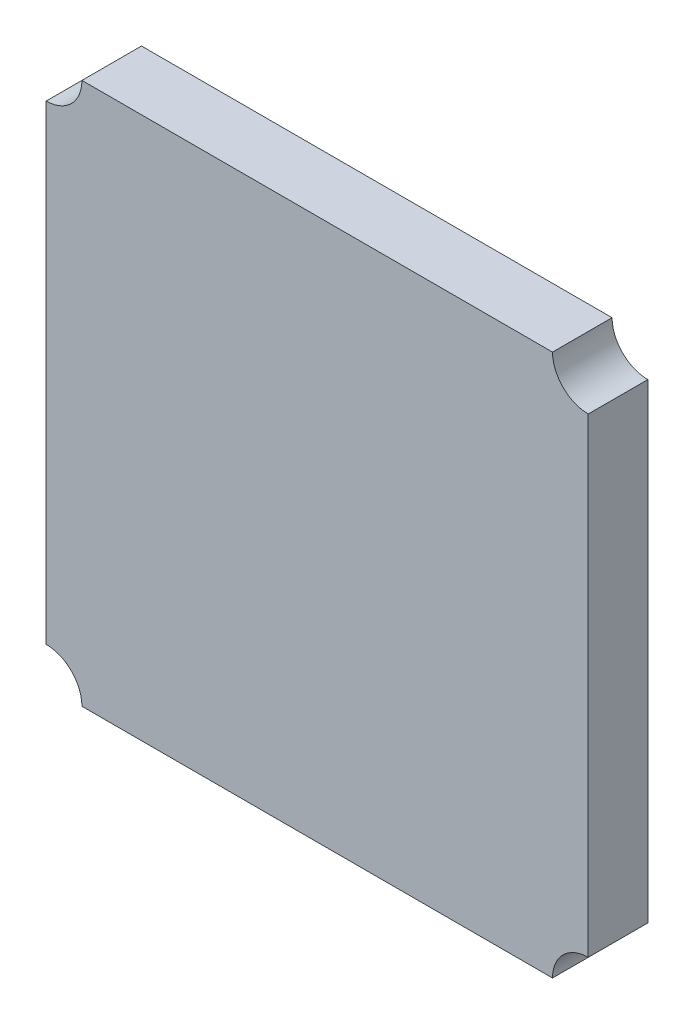
ISO-10303-21;
HEADER;
FILE_DESCRIPTION(('STEP AP214'),'2;1');
FILE_NAME('part.step','',(''),(''),'','','');
FILE_SCHEMA(('AUTOMOTIVE_DESIGN { 1 0 10303 214 1 1 1 1 }'));
ENDSEC;
DATA;
#1=APPLICATION_CONTEXT('core data for automotive mechanical design processes');
#2=APPLICATION_PROTOCOL_DEFINITION('international standard','automotive_design',2000,#1);
#3=PRODUCT_CONTEXT('',#1,'mechanical');
#4=PRODUCT('Part','Part','',(#3));
#5=PRODUCT_RELATED_PRODUCT_CATEGORY('part','',(#4));
#6=PRODUCT_DEFINITION_FORMATION('','',#4);
#7=PRODUCT_DEFINITION_CONTEXT('part definition',#1,'design');
#8=PRODUCT_DEFINITION('design','',#6,#7);
#9=PRODUCT_DEFINITION_SHAPE('','',#8);
#10=(LENGTH_UNIT() NAMED_UNIT(*) SI_UNIT(.MILLI.,.METRE.));
#11=(NAMED_UNIT(*) PLANE_ANGLE_UNIT() SI_UNIT($,.RADIAN.));
#12=(NAMED_UNIT(*) SI_UNIT($,.STERADIAN.) SOLID_ANGLE_UNIT());
#13=UNCERTAINTY_MEASURE_WITH_UNIT(LENGTH_MEASURE(1.E-05),#10,'distance_accuracy_value','');
#14=(GEOMETRIC_REPRESENTATION_CONTEXT(3) GLOBAL_UNCERTAINTY_ASSIGNED_CONTEXT((#13)) GLOBAL_UNIT_ASSIGNED_CONTEXT((#10,
#11,#12)) REPRESENTATION_CONTEXT('',''));
#15=CARTESIAN_POINT('',(0.,0.,0.));
#16=DIRECTION('',(0.,0.,1.));
#17=DIRECTION('',(1.,0.,0.));
#18=AXIS2_PLACEMENT_3D('',#15,#16,#17);
#19=CARTESIAN_POINT('',(0.,0.,5.));
#20=DIRECTION('',(0.,0.,-1.));
#21=DIRECTION('',(-1.,0.,0.));
#22=AXIS2_PLACEMENT_3D('',#19,#20,#21);
#23=CYLINDRICAL_SURFACE('',#22,3.);
#24=CARTESIAN_POINT('',(0.,0.,0.));
#25=DIRECTION('',(0.,0.,1.));
#26=DIRECTION('',(1.,0.,0.));
#27=AXIS2_PLACEMENT_3D('',#24,#25,#26);
#28=CIRCLE('',#27,3.);
#29=CARTESIAN_POINT('',(0.,-3.,0.));
#30=VERTEX_POINT('',#29);
#31=CARTESIAN_POINT('',(3.,0.,0.));
#32=VERTEX_POINT('',#31);
#33=EDGE_CURVE('E129',#30,#32,#28,.T.);
#34=ORIENTED_EDGE('',*,*,#33,.F.);
#35=DIRECTION('',(0.,0.,-1.));
#36=VECTOR('',#35,1.);
#37=CARTESIAN_POINT('',(0.,-3.,5.));
#38=LINE('',#37,#36);
#39=CARTESIAN_POINT('',(0.,-3.,5.));
#40=VERTEX_POINT('',#39);
#41=EDGE_CURVE('E11',#40,#30,#38,.T.);
#42=ORIENTED_EDGE('',*,*,#41,.F.);
#43=CARTESIAN_POINT('',(0.,0.,5.));
#44=DIRECTION('',(0.,0.,1.));
#45=DIRECTION('',(1.,0.,0.));
#46=AXIS2_PLACEMENT_3D('',#43,#44,#45);
#47=CIRCLE('',#46,3.);
#48=CARTESIAN_POINT('',(3.,0.,5.));
#49=VERTEX_POINT('',#48);
#50=EDGE_CURVE('E148',#40,#49,#47,.T.);
#51=ORIENTED_EDGE('',*,*,#50,.T.);
#52=DIRECTION('',(0.,0.,-1.));
#53=VECTOR('',#52,1.);
#54=CARTESIAN_POINT('',(3.,0.,5.));
#55=LINE('',#54,#53);
#56=EDGE_CURVE('E50',#49,#32,#55,.T.);
#57=ORIENTED_EDGE('',*,*,#56,.T.);
#58=EDGE_LOOP('',(#34,#42,#51,#57));
#59=FACE_BOUND('',#58,.T.);
#60=ADVANCED_FACE('F34',(#59),#23,.F.);
#61=CARTESIAN_POINT('',(0.,0.,5.));
#62=DIRECTION('',(1.,0.,0.));
#63=DIRECTION('',(0.,1.,0.));
#64=AXIS2_PLACEMENT_3D('',#61,#62,#63);
#65=PLANE('',#64);
#66=DIRECTION('',(0.,-1.,0.));
#67=VECTOR('',#66,1.);
#68=CARTESIAN_POINT('',(0.,0.,0.));
#69=LINE('',#68,#67);
#70=CARTESIAN_POINT('',(0.,-42.5,0.));
#71=VERTEX_POINT('',#70);
#72=EDGE_CURVE('E131',#30,#71,#69,.T.);
#73=ORIENTED_EDGE('',*,*,#72,.T.);
#74=DIRECTION('',(0.,0.,-1.));
#75=VECTOR('',#74,1.);
#76=CARTESIAN_POINT('',(0.,-42.5,5.));
#77=LINE('',#76,#75);
#78=CARTESIAN_POINT('',(0.,-42.5,5.));
#79=VERTEX_POINT('',#78);
#80=EDGE_CURVE('E42',#79,#71,#77,.T.);
#81=ORIENTED_EDGE('',*,*,#80,.F.);
#82=DIRECTION('',(0.,-1.,0.));
#83=VECTOR('',#82,1.);
#84=CARTESIAN_POINT('',(0.,0.,5.));
#85=LINE('',#84,#83);
#86=EDGE_CURVE('E255',#40,#79,#85,.T.);
#87=ORIENTED_EDGE('',*,*,#86,.F.);
#88=ORIENTED_EDGE('',*,*,#41,.T.);
#89=EDGE_LOOP('',(#73,#81,#87,#88));
#90=FACE_BOUND('',#89,.T.);
#91=ADVANCED_FACE('F165',(#90),#65,.F.);
#92=CARTESIAN_POINT('',(0.,-45.5,5.));
#93=DIRECTION('',(0.,0.,-1.));
#94=DIRECTION('',(-1.,0.,0.));
#95=AXIS2_PLACEMENT_3D('',#92,#93,#94);
#96=CYLINDRICAL_SURFACE('',#95,3.);
#97=CARTESIAN_POINT('',(0.,-45.5,0.));
#98=DIRECTION('',(0.,0.,1.));
#99=DIRECTION('',(1.,0.,0.));
#100=AXIS2_PLACEMENT_3D('',#97,#98,#99);
#101=CIRCLE('',#100,3.);
#102=CARTESIAN_POINT('',(3.,-45.5,0.));
#103=VERTEX_POINT('',#102);
#104=EDGE_CURVE('E134',#103,#71,#101,.T.);
#105=ORIENTED_EDGE('',*,*,#104,.F.);
#106=DIRECTION('',(0.,0.,-1.));
#107=VECTOR('',#106,1.);
#108=CARTESIAN_POINT('',(3.,-45.5,5.));
#109=LINE('',#108,#107);
#110=CARTESIAN_POINT('',(3.,-45.5,5.));
#111=VERTEX_POINT('',#110);
#112=EDGE_CURVE('E155',#111,#103,#109,.T.);
#113=ORIENTED_EDGE('',*,*,#112,.F.);
#114=CARTESIAN_POINT('',(0.,-45.5,5.));
#115=DIRECTION('',(0.,0.,1.));
#116=DIRECTION('',(1.,0.,0.));
#117=AXIS2_PLACEMENT_3D('',#114,#115,#116);
#118=CIRCLE('',#117,3.);
#119=EDGE_CURVE('E162',#111,#79,#118,.T.);
#120=ORIENTED_EDGE('',*,*,#119,.T.);
#121=ORIENTED_EDGE('',*,*,#80,.T.);
#122=EDGE_LOOP('',(#105,#113,#120,#121));
#123=FACE_BOUND('',#122,.T.);
#124=ADVANCED_FACE('F160',(#123),#96,.F.);
#125=CARTESIAN_POINT('',(0.,-45.5,5.));
#126=DIRECTION('',(0.,1.,0.));
#127=DIRECTION('',(0.,0.,1.));
#128=AXIS2_PLACEMENT_3D('',#125,#126,#127);
#129=PLANE('',#128);
#130=DIRECTION('',(1.,0.,0.));
#131=VECTOR('',#130,1.);
#132=CARTESIAN_POINT('',(0.,-45.5,0.));
#133=LINE('',#132,#131);
#134=CARTESIAN_POINT('',(42.5,-45.5,0.));
#135=VERTEX_POINT('',#134);
#136=EDGE_CURVE('E137',#103,#135,#133,.T.);
#137=ORIENTED_EDGE('',*,*,#136,.T.);
#138=DIRECTION('',(0.,0.,-1.));
#139=VECTOR('',#138,1.);
#140=CARTESIAN_POINT('',(42.5,-45.5,5.));
#141=LINE('',#140,#139);
#142=CARTESIAN_POINT('',(42.5,-45.5,5.));
#143=VERTEX_POINT('',#142);
#144=EDGE_CURVE('E152',#143,#135,#141,.T.);
#145=ORIENTED_EDGE('',*,*,#144,.F.);
#146=DIRECTION('',(1.,0.,0.));
#147=VECTOR('',#146,1.);
#148=CARTESIAN_POINT('',(0.,-45.5,5.));
#149=LINE('',#148,#147);
#150=EDGE_CURVE('E124',#111,#143,#149,.T.);
#151=ORIENTED_EDGE('',*,*,#150,.F.);
#152=ORIENTED_EDGE('',*,*,#112,.T.);
#153=EDGE_LOOP('',(#137,#145,#151,#152));
#154=FACE_BOUND('',#153,.T.);
#155=ADVANCED_FACE('F172',(#154),#129,.F.);
#156=CARTESIAN_POINT('',(45.5,-45.5,5.));
#157=DIRECTION('',(0.,0.,-1.));
#158=DIRECTION('',(-1.,0.,0.));
#159=AXIS2_PLACEMENT_3D('',#156,#157,#158);
#160=CYLINDRICAL_SURFACE('',#159,3.);
#161=CARTESIAN_POINT('',(45.5,-45.5,0.));
#162=DIRECTION('',(0.,0.,1.));
#163=DIRECTION('',(1.,0.,0.));
#164=AXIS2_PLACEMENT_3D('',#161,#162,#163);
#165=CIRCLE('',#164,3.);
#166=CARTESIAN_POINT('',(45.5,-42.5,0.));
#167=VERTEX_POINT('',#166);
#168=EDGE_CURVE('E139',#135,#167,#165,.F.);
#169=ORIENTED_EDGE('',*,*,#168,.T.);
#170=DIRECTION('',(0.,0.,-1.));
#171=VECTOR('',#170,1.);
#172=CARTESIAN_POINT('',(45.5,-42.5,5.));
#173=LINE('',#172,#171);
#174=CARTESIAN_POINT('',(45.5,-42.5,5.));
#175=VERTEX_POINT('',#174);
#176=EDGE_CURVE('E110',#175,#167,#173,.T.);
#177=ORIENTED_EDGE('',*,*,#176,.F.);
#178=CARTESIAN_POINT('',(45.5,-45.5,5.));
#179=DIRECTION('',(0.,0.,1.));
#180=DIRECTION('',(1.,0.,0.));
#181=AXIS2_PLACEMENT_3D('',#178,#179,#180);
#182=CIRCLE('',#181,3.);
#183=EDGE_CURVE('E121',#143,#175,#182,.F.);
#184=ORIENTED_EDGE('',*,*,#183,.F.);
#185=ORIENTED_EDGE('',*,*,#144,.T.);
#186=EDGE_LOOP('',(#169,#177,#184,#185));
#187=FACE_BOUND('',#186,.T.);
#188=ADVANCED_FACE('F175',(#187),#160,.F.);
#189=CARTESIAN_POINT('',(45.5,0.,5.));
#190=DIRECTION('',(1.,0.,0.));
#191=DIRECTION('',(0.,1.,0.));
#192=AXIS2_PLACEMENT_3D('',#189,#190,#191);
#193=PLANE('',#192);
#194=DIRECTION('',(0.,-1.,0.));
#195=VECTOR('',#194,1.);
#196=CARTESIAN_POINT('',(45.5,0.,0.));
#197=LINE('',#196,#195);
#198=CARTESIAN_POINT('',(45.5,-3.,0.));
#199=VERTEX_POINT('',#198);
#200=EDGE_CURVE('E107',#199,#167,#197,.T.);
#201=ORIENTED_EDGE('',*,*,#200,.F.);
#202=DIRECTION('',(0.,0.,-1.));
#203=VECTOR('',#202,1.);
#204=CARTESIAN_POINT('',(45.5,-3.,5.));
#205=LINE('',#204,#203);
#206=CARTESIAN_POINT('',(45.5,-3.,5.));
#207=VERTEX_POINT('',#206);
#208=EDGE_CURVE('E101',#207,#199,#205,.T.);
#209=ORIENTED_EDGE('',*,*,#208,.F.);
#210=DIRECTION('',(0.,-1.,0.));
#211=VECTOR('',#210,1.);
#212=CARTESIAN_POINT('',(45.5,0.,5.));
#213=LINE('',#212,#211);
#214=EDGE_CURVE('E105',#207,#175,#213,.T.);
#215=ORIENTED_EDGE('',*,*,#214,.T.);
#216=ORIENTED_EDGE('',*,*,#176,.T.);
#217=EDGE_LOOP('',(#201,#209,#215,#216));
#218=FACE_BOUND('',#217,.T.);
#219=ADVANCED_FACE('F103',(#218),#193,.T.);
#220=CARTESIAN_POINT('',(45.5,0.,5.));
#221=DIRECTION('',(0.,0.,-1.));
#222=DIRECTION('',(-1.,0.,0.));
#223=AXIS2_PLACEMENT_3D('',#220,#221,#222);
#224=CYLINDRICAL_SURFACE('',#223,3.);
#225=CARTESIAN_POINT('',(45.5,0.,0.));
#226=DIRECTION('',(0.,0.,1.));
#227=DIRECTION('',(1.,0.,0.));
#228=AXIS2_PLACEMENT_3D('',#225,#226,#227);
#229=CIRCLE('',#228,3.);
#230=CARTESIAN_POINT('',(42.5,0.,0.));
#231=VERTEX_POINT('',#230);
#232=EDGE_CURVE('E143',#199,#231,#229,.F.);
#233=ORIENTED_EDGE('',*,*,#232,.T.);
#234=DIRECTION('',(0.,0.,-1.));
#235=VECTOR('',#234,1.);
#236=CARTESIAN_POINT('',(42.5,0.,5.));
#237=LINE('',#236,#235);
#238=CARTESIAN_POINT('',(42.5,0.,5.));
#239=VERTEX_POINT('',#238);
#240=EDGE_CURVE('E76',#239,#231,#237,.T.);
#241=ORIENTED_EDGE('',*,*,#240,.F.);
#242=CARTESIAN_POINT('',(45.5,0.,5.));
#243=DIRECTION('',(0.,0.,1.));
#244=DIRECTION('',(1.,0.,0.));
#245=AXIS2_PLACEMENT_3D('',#242,#243,#244);
#246=CIRCLE('',#245,3.);
#247=EDGE_CURVE('E112',#207,#239,#246,.F.);
#248=ORIENTED_EDGE('',*,*,#247,.F.);
#249=ORIENTED_EDGE('',*,*,#208,.T.);
#250=EDGE_LOOP('',(#233,#241,#248,#249));
#251=FACE_BOUND('',#250,.T.);
#252=ADVANCED_FACE('F113',(#251),#224,.F.);
#253=CARTESIAN_POINT('',(0.,0.,5.));
#254=DIRECTION('',(0.,1.,0.));
#255=DIRECTION('',(0.,0.,1.));
#256=AXIS2_PLACEMENT_3D('',#253,#254,#255);
#257=PLANE('',#256);
#258=DIRECTION('',(1.,0.,0.));
#259=VECTOR('',#258,1.);
#260=CARTESIAN_POINT('',(0.,0.,0.));
#261=LINE('',#260,#259);
#262=EDGE_CURVE('E145',#32,#231,#261,.T.);
#263=ORIENTED_EDGE('',*,*,#262,.F.);
#264=ORIENTED_EDGE('',*,*,#56,.F.);
#265=DIRECTION('',(1.,0.,0.));
#266=VECTOR('',#265,1.);
#267=CARTESIAN_POINT('',(0.,0.,5.));
#268=LINE('',#267,#266);
#269=EDGE_CURVE('E116',#49,#239,#268,.T.);
#270=ORIENTED_EDGE('',*,*,#269,.T.);
#271=ORIENTED_EDGE('',*,*,#240,.T.);
#272=EDGE_LOOP('',(#263,#264,#270,#271));
#273=FACE_BOUND('',#272,.T.);
#274=ADVANCED_FACE('F176',(#273),#257,.T.);
#275=CARTESIAN_POINT('',(0.,0.,5.));
#276=DIRECTION('',(0.,0.,1.));
#277=DIRECTION('',(1.,0.,0.));
#278=AXIS2_PLACEMENT_3D('',#275,#276,#277);
#279=PLANE('',#278);
#280=ORIENTED_EDGE('',*,*,#50,.F.);
#281=ORIENTED_EDGE('',*,*,#86,.T.);
#282=ORIENTED_EDGE('',*,*,#119,.F.);
#283=ORIENTED_EDGE('',*,*,#150,.T.);
#284=ORIENTED_EDGE('',*,*,#183,.T.);
#285=ORIENTED_EDGE('',*,*,#214,.F.);
#286=ORIENTED_EDGE('',*,*,#247,.T.);
#287=ORIENTED_EDGE('',*,*,#269,.F.);
#288=EDGE_LOOP('',(#280,#281,#282,#283,#284,#285,#286,#287));
#289=FACE_BOUND('',#288,.T.);
#290=ADVANCED_FACE('F119',(#289),#279,.T.);
#291=CARTESIAN_POINT('',(0.,0.,0.));
#292=DIRECTION('',(0.,0.,1.));
#293=DIRECTION('',(1.,0.,0.));
#294=AXIS2_PLACEMENT_3D('',#291,#292,#293);
#295=PLANE('',#294);
#296=ORIENTED_EDGE('',*,*,#33,.T.);
#297=ORIENTED_EDGE('',*,*,#262,.T.);
#298=ORIENTED_EDGE('',*,*,#232,.F.);
#299=ORIENTED_EDGE('',*,*,#200,.T.);
#300=ORIENTED_EDGE('',*,*,#168,.F.);
#301=ORIENTED_EDGE('',*,*,#136,.F.);
#302=ORIENTED_EDGE('',*,*,#104,.T.);
#303=ORIENTED_EDGE('',*,*,#72,.F.);
#304=EDGE_LOOP('',(#296,#297,#298,#299,#300,#301,#302,#303));
#305=FACE_BOUND('',#304,.T.);
#306=ADVANCED_FACE('F168',(#305),#295,.F.);
#307=CLOSED_SHELL('',(#60,#91,#124,#155,#188,#219,#252,#274,#290,#306));
#308=MANIFOLD_SOLID_BREP('B2',#307);
#309=ADVANCED_BREP_SHAPE_REPRESENTATION('',(#18,#308),#14);
#310=SHAPE_DEFINITION_REPRESENTATION(#9,#309);
ENDSEC;
END-ISO-10303-21;
